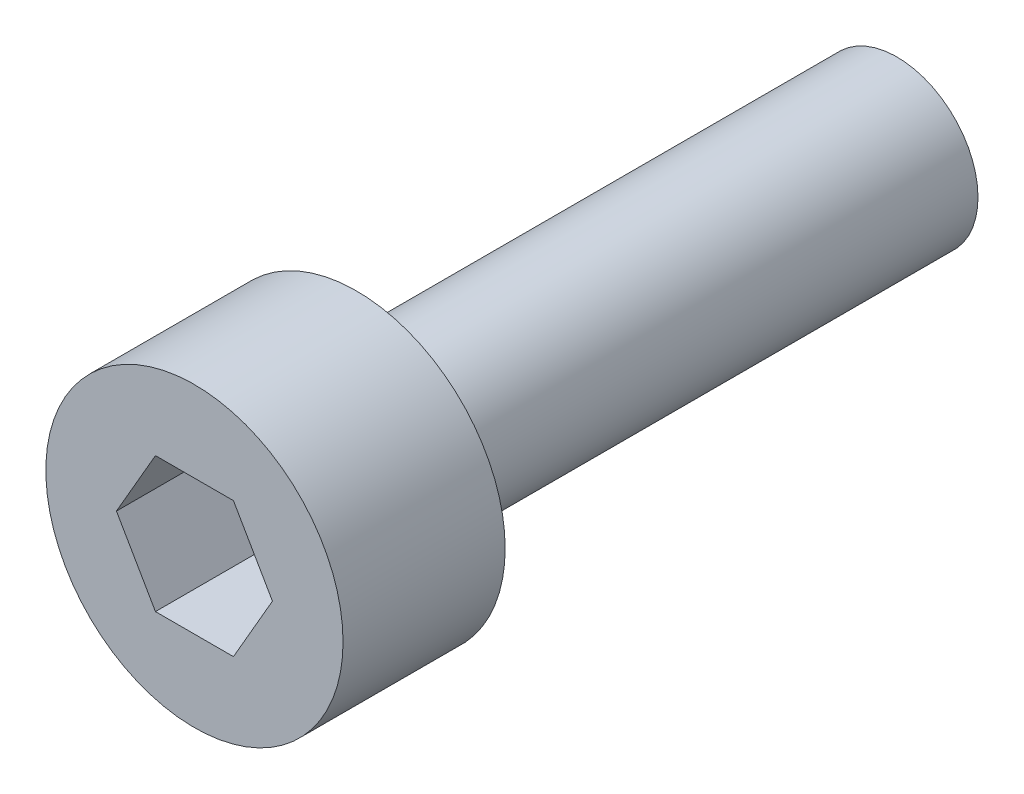
ISO-10303-21;
HEADER;
FILE_DESCRIPTION(('STEP AP214'),'2;1');
FILE_NAME('part.step','',(''),(''),'','','');
FILE_SCHEMA(('AUTOMOTIVE_DESIGN { 1 0 10303 214 1 1 1 1 }'));
ENDSEC;
DATA;
#1=APPLICATION_CONTEXT('core data for automotive mechanical design processes');
#2=APPLICATION_PROTOCOL_DEFINITION('international standard','automotive_design',2000,#1);
#3=PRODUCT_CONTEXT('',#1,'mechanical');
#4=PRODUCT('Part','Part','',(#3));
#5=PRODUCT_RELATED_PRODUCT_CATEGORY('part','',(#4));
#6=PRODUCT_DEFINITION_FORMATION('','',#4);
#7=PRODUCT_DEFINITION_CONTEXT('part definition',#1,'design');
#8=PRODUCT_DEFINITION('design','',#6,#7);
#9=PRODUCT_DEFINITION_SHAPE('','',#8);
#10=(LENGTH_UNIT() NAMED_UNIT(*) SI_UNIT(.MILLI.,.METRE.));
#11=(NAMED_UNIT(*) PLANE_ANGLE_UNIT() SI_UNIT($,.RADIAN.));
#12=(NAMED_UNIT(*) SI_UNIT($,.STERADIAN.) SOLID_ANGLE_UNIT());
#13=UNCERTAINTY_MEASURE_WITH_UNIT(LENGTH_MEASURE(1.E-05),#10,'distance_accuracy_value','');
#14=(GEOMETRIC_REPRESENTATION_CONTEXT(3) GLOBAL_UNCERTAINTY_ASSIGNED_CONTEXT((#13)) GLOBAL_UNIT_ASSIGNED_CONTEXT((#10,
#11,#12)) REPRESENTATION_CONTEXT('',''));
#15=CARTESIAN_POINT('',(0.,0.,0.));
#16=DIRECTION('',(0.,0.,1.));
#17=DIRECTION('',(1.,0.,0.));
#18=AXIS2_PLACEMENT_3D('',#15,#16,#17);
#19=CARTESIAN_POINT('',(0.,0.,10.));
#20=DIRECTION('',(0.,0.,-1.));
#21=DIRECTION('',(-1.,0.,0.));
#22=AXIS2_PLACEMENT_3D('',#19,#20,#21);
#23=CYLINDRICAL_SURFACE('',#22,1.5);
#24=CARTESIAN_POINT('',(0.,0.,10.));
#25=DIRECTION('',(0.,0.,1.));
#26=DIRECTION('',(1.,0.,0.));
#27=AXIS2_PLACEMENT_3D('',#24,#25,#26);
#28=CIRCLE('',#27,1.5);
#29=CARTESIAN_POINT('',(1.5,0.,10.));
#30=VERTEX_POINT('',#29);
#31=EDGE_CURVE('E11',#30,#30,#28,.T.);
#32=ORIENTED_EDGE('',*,*,#31,.F.);
#33=EDGE_LOOP('',(#32));
#34=FACE_BOUND('',#33,.T.);
#35=CARTESIAN_POINT('',(0.,0.,0.));
#36=DIRECTION('',(0.,0.,1.));
#37=DIRECTION('',(1.,0.,0.));
#38=AXIS2_PLACEMENT_3D('',#35,#36,#37);
#39=CIRCLE('',#38,1.5);
#40=CARTESIAN_POINT('',(1.5,0.,0.));
#41=VERTEX_POINT('',#40);
#42=EDGE_CURVE('E42',#41,#41,#39,.T.);
#43=ORIENTED_EDGE('',*,*,#42,.T.);
#44=EDGE_LOOP('',(#43));
#45=FACE_BOUND('',#44,.T.);
#46=ADVANCED_FACE('F39',(#34,#45),#23,.T.);
#47=CARTESIAN_POINT('',(0.,0.,0.));
#48=DIRECTION('',(0.,0.,1.));
#49=DIRECTION('',(1.,0.,0.));
#50=AXIS2_PLACEMENT_3D('',#47,#48,#49);
#51=PLANE('',#50);
#52=ORIENTED_EDGE('',*,*,#42,.F.);
#53=EDGE_LOOP('',(#52));
#54=FACE_BOUND('',#53,.T.);
#55=ADVANCED_FACE('F170',(#54),#51,.F.);
#56=CARTESIAN_POINT('',(0.,0.,13.));
#57=DIRECTION('',(0.,0.,-1.));
#58=DIRECTION('',(-1.,0.,0.));
#59=AXIS2_PLACEMENT_3D('',#56,#57,#58);
#60=CYLINDRICAL_SURFACE('',#59,2.75);
#61=CARTESIAN_POINT('',(0.,0.,13.));
#62=DIRECTION('',(0.,0.,1.));
#63=DIRECTION('',(1.,0.,0.));
#64=AXIS2_PLACEMENT_3D('',#61,#62,#63);
#65=CIRCLE('',#64,2.75);
#66=CARTESIAN_POINT('',(2.75,0.,13.));
#67=VERTEX_POINT('',#66);
#68=EDGE_CURVE('E146',#67,#67,#65,.T.);
#69=ORIENTED_EDGE('',*,*,#68,.F.);
#70=EDGE_LOOP('',(#69));
#71=FACE_BOUND('',#70,.T.);
#72=CARTESIAN_POINT('',(0.,0.,10.));
#73=DIRECTION('',(0.,0.,1.));
#74=DIRECTION('',(1.,0.,0.));
#75=AXIS2_PLACEMENT_3D('',#72,#73,#74);
#76=CIRCLE('',#75,2.75);
#77=CARTESIAN_POINT('',(2.75,0.,10.));
#78=VERTEX_POINT('',#77);
#79=EDGE_CURVE('E140',#78,#78,#76,.T.);
#80=ORIENTED_EDGE('',*,*,#79,.T.);
#81=EDGE_LOOP('',(#80));
#82=FACE_BOUND('',#81,.T.);
#83=ADVANCED_FACE('F152',(#71,#82),#60,.T.);
#84=CARTESIAN_POINT('',(0.,0.,13.));
#85=DIRECTION('',(0.,0.,1.));
#86=DIRECTION('',(1.,0.,0.));
#87=AXIS2_PLACEMENT_3D('',#84,#85,#86);
#88=PLANE('',#87);
#89=DIRECTION('',(0.5,0.866025403784439,0.));
#90=VECTOR('',#89,1.);
#91=CARTESIAN_POINT('',(0.721687836487032,-1.25,13.));
#92=LINE('',#91,#90);
#93=CARTESIAN_POINT('',(0.721687836487032,-1.25,13.));
#94=VERTEX_POINT('',#93);
#95=CARTESIAN_POINT('',(1.44337567297406,0.,13.));
#96=VERTEX_POINT('',#95);
#97=EDGE_CURVE('E53',#94,#96,#92,.T.);
#98=ORIENTED_EDGE('',*,*,#97,.F.);
#99=DIRECTION('',(1.,0.,0.));
#100=VECTOR('',#99,1.);
#101=CARTESIAN_POINT('',(-0.721687836487033,-1.25,13.));
#102=LINE('',#101,#100);
#103=CARTESIAN_POINT('',(-0.721687836487033,-1.25,13.));
#104=VERTEX_POINT('',#103);
#105=EDGE_CURVE('E136',#104,#94,#102,.T.);
#106=ORIENTED_EDGE('',*,*,#105,.F.);
#107=DIRECTION('',(0.5,-0.866025403784439,0.));
#108=VECTOR('',#107,1.);
#109=CARTESIAN_POINT('',(-1.44337567297407,0.,13.));
#110=LINE('',#109,#108);
#111=CARTESIAN_POINT('',(-1.44337567297407,0.,13.));
#112=VERTEX_POINT('',#111);
#113=EDGE_CURVE('E134',#112,#104,#110,.T.);
#114=ORIENTED_EDGE('',*,*,#113,.F.);
#115=DIRECTION('',(-0.5,-0.866025403784439,0.));
#116=VECTOR('',#115,1.);
#117=CARTESIAN_POINT('',(-0.721687836487033,1.25,13.));
#118=LINE('',#117,#116);
#119=CARTESIAN_POINT('',(-0.721687836487033,1.25,13.));
#120=VERTEX_POINT('',#119);
#121=EDGE_CURVE('E101',#120,#112,#118,.T.);
#122=ORIENTED_EDGE('',*,*,#121,.F.);
#123=DIRECTION('',(-1.,0.,0.));
#124=VECTOR('',#123,1.);
#125=CARTESIAN_POINT('',(0.721687836487032,1.25,13.));
#126=LINE('',#125,#124);
#127=CARTESIAN_POINT('',(0.721687836487032,1.25,13.));
#128=VERTEX_POINT('',#127);
#129=EDGE_CURVE('E130',#128,#120,#126,.T.);
#130=ORIENTED_EDGE('',*,*,#129,.F.);
#131=DIRECTION('',(-0.5,0.866025403784439,0.));
#132=VECTOR('',#131,1.);
#133=CARTESIAN_POINT('',(1.44337567297406,0.,13.));
#134=LINE('',#133,#132);
#135=EDGE_CURVE('E127',#96,#128,#134,.T.);
#136=ORIENTED_EDGE('',*,*,#135,.F.);
#137=EDGE_LOOP('',(#98,#106,#114,#122,#130,#136));
#138=FACE_BOUND('',#137,.T.);
#139=ORIENTED_EDGE('',*,*,#68,.T.);
#140=EDGE_LOOP('',(#139));
#141=FACE_BOUND('',#140,.T.);
#142=ADVANCED_FACE('F157',(#138,#141),#88,.T.);
#143=CARTESIAN_POINT('',(0.,0.,10.));
#144=DIRECTION('',(0.,0.,1.));
#145=DIRECTION('',(1.,0.,0.));
#146=AXIS2_PLACEMENT_3D('',#143,#144,#145);
#147=PLANE('',#146);
#148=ORIENTED_EDGE('',*,*,#31,.T.);
#149=EDGE_LOOP('',(#148));
#150=FACE_BOUND('',#149,.T.);
#151=ORIENTED_EDGE('',*,*,#79,.F.);
#152=EDGE_LOOP('',(#151));
#153=FACE_BOUND('',#152,.T.);
#154=ADVANCED_FACE('F154',(#150,#153),#147,.F.);
#155=CARTESIAN_POINT('',(0.721687836487032,-1.25,11.));
#156=DIRECTION('',(0.866025403784439,-0.5,0.));
#157=DIRECTION('',(0.5,0.866025403784439,0.));
#158=AXIS2_PLACEMENT_3D('',#155,#156,#157);
#159=PLANE('',#158);
#160=ORIENTED_EDGE('',*,*,#97,.T.);
#161=DIRECTION('',(0.,0.,1.));
#162=VECTOR('',#161,1.);
#163=CARTESIAN_POINT('',(1.44337567297406,0.,11.));
#164=LINE('',#163,#162);
#165=CARTESIAN_POINT('',(1.44337567297406,0.,11.));
#166=VERTEX_POINT('',#165);
#167=EDGE_CURVE('E83',#166,#96,#164,.T.);
#168=ORIENTED_EDGE('',*,*,#167,.F.);
#169=DIRECTION('',(0.5,0.866025403784439,0.));
#170=VECTOR('',#169,1.);
#171=CARTESIAN_POINT('',(0.721687836487032,-1.25,11.));
#172=LINE('',#171,#170);
#173=CARTESIAN_POINT('',(0.721687836487032,-1.25,11.));
#174=VERTEX_POINT('',#173);
#175=EDGE_CURVE('E138',#174,#166,#172,.T.);
#176=ORIENTED_EDGE('',*,*,#175,.F.);
#177=DIRECTION('',(0.,0.,1.));
#178=VECTOR('',#177,1.);
#179=CARTESIAN_POINT('',(0.721687836487032,-1.25,11.));
#180=LINE('',#179,#178);
#181=EDGE_CURVE('E61',#174,#94,#180,.T.);
#182=ORIENTED_EDGE('',*,*,#181,.T.);
#183=EDGE_LOOP('',(#160,#168,#176,#182));
#184=FACE_BOUND('',#183,.T.);
#185=ADVANCED_FACE('F156',(#184),#159,.F.);
#186=CARTESIAN_POINT('',(-0.721687836487033,-1.25,11.));
#187=DIRECTION('',(0.,-1.,0.));
#188=DIRECTION('',(1.,0.,0.));
#189=AXIS2_PLACEMENT_3D('',#186,#187,#188);
#190=PLANE('',#189);
#191=ORIENTED_EDGE('',*,*,#105,.T.);
#192=ORIENTED_EDGE('',*,*,#181,.F.);
#193=DIRECTION('',(1.,0.,0.));
#194=VECTOR('',#193,1.);
#195=CARTESIAN_POINT('',(-0.721687836487033,-1.25,11.));
#196=LINE('',#195,#194);
#197=CARTESIAN_POINT('',(-0.721687836487033,-1.25,11.));
#198=VERTEX_POINT('',#197);
#199=EDGE_CURVE('E113',#198,#174,#196,.T.);
#200=ORIENTED_EDGE('',*,*,#199,.F.);
#201=DIRECTION('',(0.,0.,1.));
#202=VECTOR('',#201,1.);
#203=CARTESIAN_POINT('',(-0.721687836487033,-1.25,11.));
#204=LINE('',#203,#202);
#205=EDGE_CURVE('E105',#198,#104,#204,.T.);
#206=ORIENTED_EDGE('',*,*,#205,.T.);
#207=EDGE_LOOP('',(#191,#192,#200,#206));
#208=FACE_BOUND('',#207,.T.);
#209=ADVANCED_FACE('F164',(#208),#190,.F.);
#210=CARTESIAN_POINT('',(-1.44337567297407,0.,11.));
#211=DIRECTION('',(-0.866025403784439,-0.5,0.));
#212=DIRECTION('',(0.5,-0.866025403784439,0.));
#213=AXIS2_PLACEMENT_3D('',#210,#211,#212);
#214=PLANE('',#213);
#215=ORIENTED_EDGE('',*,*,#113,.T.);
#216=ORIENTED_EDGE('',*,*,#205,.F.);
#217=DIRECTION('',(0.5,-0.866025403784439,0.));
#218=VECTOR('',#217,1.);
#219=CARTESIAN_POINT('',(-1.44337567297407,0.,11.));
#220=LINE('',#219,#218);
#221=CARTESIAN_POINT('',(-1.44337567297407,0.,11.));
#222=VERTEX_POINT('',#221);
#223=EDGE_CURVE('E109',#222,#198,#220,.T.);
#224=ORIENTED_EDGE('',*,*,#223,.F.);
#225=DIRECTION('',(0.,0.,1.));
#226=VECTOR('',#225,1.);
#227=CARTESIAN_POINT('',(-1.44337567297407,0.,11.));
#228=LINE('',#227,#226);
#229=EDGE_CURVE('E94',#222,#112,#228,.T.);
#230=ORIENTED_EDGE('',*,*,#229,.T.);
#231=EDGE_LOOP('',(#215,#216,#224,#230));
#232=FACE_BOUND('',#231,.T.);
#233=ADVANCED_FACE('F110',(#232),#214,.F.);
#234=CARTESIAN_POINT('',(-0.721687836487033,1.25,11.));
#235=DIRECTION('',(-0.866025403784439,0.5,0.));
#236=DIRECTION('',(-0.5,-0.866025403784439,0.));
#237=AXIS2_PLACEMENT_3D('',#234,#235,#236);
#238=PLANE('',#237);
#239=ORIENTED_EDGE('',*,*,#121,.T.);
#240=ORIENTED_EDGE('',*,*,#229,.F.);
#241=DIRECTION('',(-0.5,-0.866025403784439,0.));
#242=VECTOR('',#241,1.);
#243=CARTESIAN_POINT('',(-0.721687836487033,1.25,11.));
#244=LINE('',#243,#242);
#245=CARTESIAN_POINT('',(-0.721687836487033,1.25,11.));
#246=VERTEX_POINT('',#245);
#247=EDGE_CURVE('E98',#246,#222,#244,.T.);
#248=ORIENTED_EDGE('',*,*,#247,.F.);
#249=DIRECTION('',(0.,0.,1.));
#250=VECTOR('',#249,1.);
#251=CARTESIAN_POINT('',(-0.721687836487033,1.25,11.));
#252=LINE('',#251,#250);
#253=EDGE_CURVE('E106',#246,#120,#252,.T.);
#254=ORIENTED_EDGE('',*,*,#253,.T.);
#255=EDGE_LOOP('',(#239,#240,#248,#254));
#256=FACE_BOUND('',#255,.T.);
#257=ADVANCED_FACE('F96',(#256),#238,.F.);
#258=CARTESIAN_POINT('',(0.721687836487032,1.25,11.));
#259=DIRECTION('',(0.,1.,0.));
#260=DIRECTION('',(0.,0.,1.));
#261=AXIS2_PLACEMENT_3D('',#258,#259,#260);
#262=PLANE('',#261);
#263=ORIENTED_EDGE('',*,*,#129,.T.);
#264=ORIENTED_EDGE('',*,*,#253,.F.);
#265=DIRECTION('',(-1.,0.,0.));
#266=VECTOR('',#265,1.);
#267=CARTESIAN_POINT('',(0.721687836487032,1.25,11.));
#268=LINE('',#267,#266);
#269=CARTESIAN_POINT('',(0.721687836487032,1.25,11.));
#270=VERTEX_POINT('',#269);
#271=EDGE_CURVE('E119',#270,#246,#268,.T.);
#272=ORIENTED_EDGE('',*,*,#271,.F.);
#273=DIRECTION('',(0.,0.,1.));
#274=VECTOR('',#273,1.);
#275=CARTESIAN_POINT('',(0.721687836487032,1.25,11.));
#276=LINE('',#275,#274);
#277=EDGE_CURVE('E143',#270,#128,#276,.T.);
#278=ORIENTED_EDGE('',*,*,#277,.T.);
#279=EDGE_LOOP('',(#263,#264,#272,#278));
#280=FACE_BOUND('',#279,.T.);
#281=ADVANCED_FACE('F225',(#280),#262,.F.);
#282=CARTESIAN_POINT('',(1.44337567297406,0.,11.));
#283=DIRECTION('',(0.866025403784439,0.5,0.));
#284=DIRECTION('',(-0.5,0.866025403784439,0.));
#285=AXIS2_PLACEMENT_3D('',#282,#283,#284);
#286=PLANE('',#285);
#287=ORIENTED_EDGE('',*,*,#135,.T.);
#288=ORIENTED_EDGE('',*,*,#277,.F.);
#289=DIRECTION('',(-0.5,0.866025403784439,0.));
#290=VECTOR('',#289,1.);
#291=CARTESIAN_POINT('',(1.44337567297406,0.,11.));
#292=LINE('',#291,#290);
#293=EDGE_CURVE('E121',#166,#270,#292,.T.);
#294=ORIENTED_EDGE('',*,*,#293,.F.);
#295=ORIENTED_EDGE('',*,*,#167,.T.);
#296=EDGE_LOOP('',(#287,#288,#294,#295));
#297=FACE_BOUND('',#296,.T.);
#298=ADVANCED_FACE('F234',(#297),#286,.F.);
#299=CARTESIAN_POINT('',(0.,0.,11.));
#300=DIRECTION('',(0.,0.,1.));
#301=DIRECTION('',(1.,0.,0.));
#302=AXIS2_PLACEMENT_3D('',#299,#300,#301);
#303=PLANE('',#302);
#304=ORIENTED_EDGE('',*,*,#175,.T.);
#305=ORIENTED_EDGE('',*,*,#293,.T.);
#306=ORIENTED_EDGE('',*,*,#271,.T.);
#307=ORIENTED_EDGE('',*,*,#247,.T.);
#308=ORIENTED_EDGE('',*,*,#223,.T.);
#309=ORIENTED_EDGE('',*,*,#199,.T.);
#310=EDGE_LOOP('',(#304,#305,#306,#307,#308,#309));
#311=FACE_BOUND('',#310,.T.);
#312=ADVANCED_FACE('F116',(#311),#303,.T.);
#313=CLOSED_SHELL('',(#46,#55,#83,#142,#154,#185,#209,#233,#257,#281,#298,#312));
#314=MANIFOLD_SOLID_BREP('B2',#313);
#315=ADVANCED_BREP_SHAPE_REPRESENTATION('',(#18,#314),#14);
#316=SHAPE_DEFINITION_REPRESENTATION(#9,#315);
ENDSEC;
END-ISO-10303-21;
